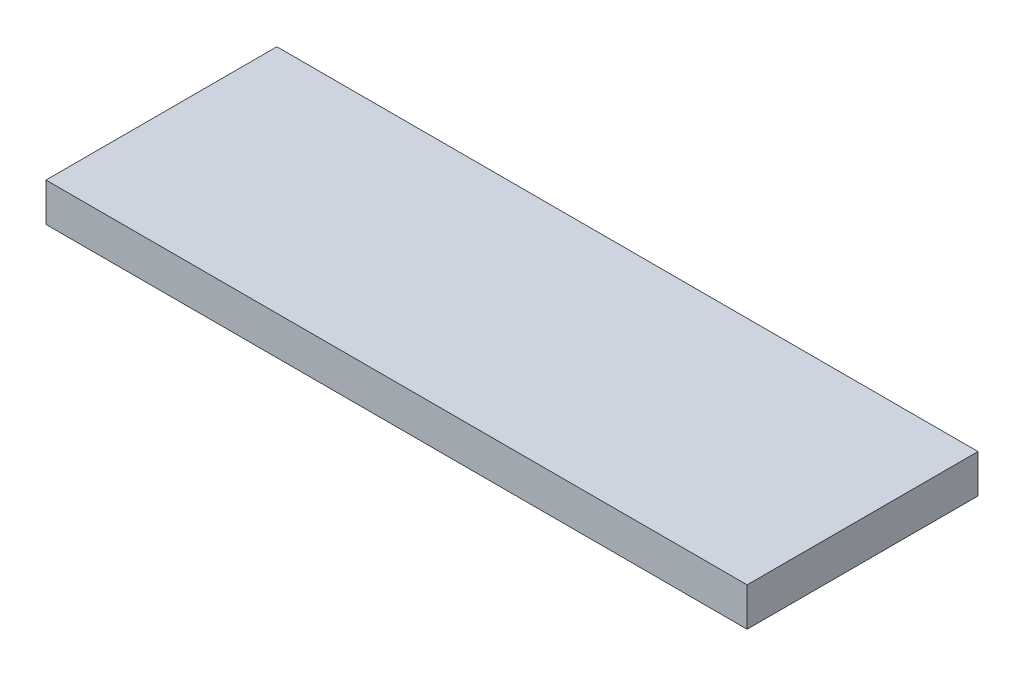
ISO-10303-21;
HEADER;
FILE_DESCRIPTION(('STEP AP214'),'2;1');
FILE_NAME('part.step','',(''),(''),'','','');
FILE_SCHEMA(('AUTOMOTIVE_DESIGN { 1 0 10303 214 1 1 1 1 }'));
ENDSEC;
DATA;
#1=APPLICATION_CONTEXT('core data for automotive mechanical design processes');
#2=APPLICATION_PROTOCOL_DEFINITION('international standard','automotive_design',2000,#1);
#3=PRODUCT_CONTEXT('',#1,'mechanical');
#4=PRODUCT('Part','Part','',(#3));
#5=PRODUCT_RELATED_PRODUCT_CATEGORY('part','',(#4));
#6=PRODUCT_DEFINITION_FORMATION('','',#4);
#7=PRODUCT_DEFINITION_CONTEXT('part definition',#1,'design');
#8=PRODUCT_DEFINITION('design','',#6,#7);
#9=PRODUCT_DEFINITION_SHAPE('','',#8);
#10=(LENGTH_UNIT() NAMED_UNIT(*) SI_UNIT(.MILLI.,.METRE.));
#11=(NAMED_UNIT(*) PLANE_ANGLE_UNIT() SI_UNIT($,.RADIAN.));
#12=(NAMED_UNIT(*) SI_UNIT($,.STERADIAN.) SOLID_ANGLE_UNIT());
#13=UNCERTAINTY_MEASURE_WITH_UNIT(LENGTH_MEASURE(1.E-05),#10,'distance_accuracy_value','');
#14=(GEOMETRIC_REPRESENTATION_CONTEXT(3) GLOBAL_UNCERTAINTY_ASSIGNED_CONTEXT((#13)) GLOBAL_UNIT_ASSIGNED_CONTEXT((#10,
#11,#12)) REPRESENTATION_CONTEXT('',''));
#15=CARTESIAN_POINT('',(0.,0.,0.));
#16=DIRECTION('',(0.,0.,1.));
#17=DIRECTION('',(1.,0.,0.));
#18=AXIS2_PLACEMENT_3D('',#15,#16,#17);
#19=CARTESIAN_POINT('',(82.,9.,27.));
#20=DIRECTION('',(-1.,0.,0.));
#21=DIRECTION('',(0.,0.,1.));
#22=AXIS2_PLACEMENT_3D('',#19,#20,#21);
#23=PLANE('',#22);
#24=DIRECTION('',(0.,0.,-1.));
#25=VECTOR('',#24,1.);
#26=CARTESIAN_POINT('',(82.,0.,27.));
#27=LINE('',#26,#25);
#28=CARTESIAN_POINT('',(82.,0.,27.));
#29=VERTEX_POINT('',#28);
#30=CARTESIAN_POINT('',(82.,0.,-27.));
#31=VERTEX_POINT('',#30);
#32=EDGE_CURVE('E105',#29,#31,#27,.T.);
#33=ORIENTED_EDGE('',*,*,#32,.T.);
#34=DIRECTION('',(0.,-1.,0.));
#35=VECTOR('',#34,1.);
#36=CARTESIAN_POINT('',(82.,9.,-27.));
#37=LINE('',#36,#35);
#38=CARTESIAN_POINT('',(82.,9.,-27.));
#39=VERTEX_POINT('',#38);
#40=EDGE_CURVE('E11',#39,#31,#37,.T.);
#41=ORIENTED_EDGE('',*,*,#40,.F.);
#42=DIRECTION('',(0.,0.,-1.));
#43=VECTOR('',#42,1.);
#44=CARTESIAN_POINT('',(82.,9.,27.));
#45=LINE('',#44,#43);
#46=CARTESIAN_POINT('',(82.,9.,27.));
#47=VERTEX_POINT('',#46);
#48=EDGE_CURVE('E89',#47,#39,#45,.T.);
#49=ORIENTED_EDGE('',*,*,#48,.F.);
#50=DIRECTION('',(0.,-1.,0.));
#51=VECTOR('',#50,1.);
#52=CARTESIAN_POINT('',(82.,9.,27.));
#53=LINE('',#52,#51);
#54=EDGE_CURVE('E98',#47,#29,#53,.T.);
#55=ORIENTED_EDGE('',*,*,#54,.T.);
#56=EDGE_LOOP('',(#33,#41,#49,#55));
#57=FACE_BOUND('',#56,.T.);
#58=ADVANCED_FACE('F39',(#57),#23,.F.);
#59=CARTESIAN_POINT('',(-82.,9.,-27.));
#60=DIRECTION('',(0.,0.,1.));
#61=DIRECTION('',(1.,0.,0.));
#62=AXIS2_PLACEMENT_3D('',#59,#60,#61);
#63=PLANE('',#62);
#64=DIRECTION('',(-1.,0.,0.));
#65=VECTOR('',#64,1.);
#66=CARTESIAN_POINT('',(-82.,0.,-27.));
#67=LINE('',#66,#65);
#68=CARTESIAN_POINT('',(-82.,0.,-27.));
#69=VERTEX_POINT('',#68);
#70=EDGE_CURVE('E94',#31,#69,#67,.T.);
#71=ORIENTED_EDGE('',*,*,#70,.T.);
#72=DIRECTION('',(0.,-1.,0.));
#73=VECTOR('',#72,1.);
#74=CARTESIAN_POINT('',(-82.,9.,-27.));
#75=LINE('',#74,#73);
#76=CARTESIAN_POINT('',(-82.,9.,-27.));
#77=VERTEX_POINT('',#76);
#78=EDGE_CURVE('E50',#77,#69,#75,.T.);
#79=ORIENTED_EDGE('',*,*,#78,.F.);
#80=DIRECTION('',(-1.,0.,0.));
#81=VECTOR('',#80,1.);
#82=CARTESIAN_POINT('',(-82.,9.,-27.));
#83=LINE('',#82,#81);
#84=EDGE_CURVE('E84',#39,#77,#83,.T.);
#85=ORIENTED_EDGE('',*,*,#84,.F.);
#86=ORIENTED_EDGE('',*,*,#40,.T.);
#87=EDGE_LOOP('',(#71,#79,#85,#86));
#88=FACE_BOUND('',#87,.T.);
#89=ADVANCED_FACE('F91',(#88),#63,.F.);
#90=CARTESIAN_POINT('',(-82.,9.,27.));
#91=DIRECTION('',(1.,0.,0.));
#92=DIRECTION('',(0.,0.,-1.));
#93=AXIS2_PLACEMENT_3D('',#90,#91,#92);
#94=PLANE('',#93);
#95=DIRECTION('',(0.,0.,1.));
#96=VECTOR('',#95,1.);
#97=CARTESIAN_POINT('',(-82.,0.,27.));
#98=LINE('',#97,#96);
#99=CARTESIAN_POINT('',(-82.,0.,27.));
#100=VERTEX_POINT('',#99);
#101=EDGE_CURVE('E75',#69,#100,#98,.T.);
#102=ORIENTED_EDGE('',*,*,#101,.T.);
#103=DIRECTION('',(0.,-1.,0.));
#104=VECTOR('',#103,1.);
#105=CARTESIAN_POINT('',(-82.,9.,27.));
#106=LINE('',#105,#104);
#107=CARTESIAN_POINT('',(-82.,9.,27.));
#108=VERTEX_POINT('',#107);
#109=EDGE_CURVE('E92',#108,#100,#106,.T.);
#110=ORIENTED_EDGE('',*,*,#109,.F.);
#111=DIRECTION('',(0.,0.,1.));
#112=VECTOR('',#111,1.);
#113=CARTESIAN_POINT('',(-82.,9.,27.));
#114=LINE('',#113,#112);
#115=EDGE_CURVE('E86',#77,#108,#114,.T.);
#116=ORIENTED_EDGE('',*,*,#115,.F.);
#117=ORIENTED_EDGE('',*,*,#78,.T.);
#118=EDGE_LOOP('',(#102,#110,#116,#117));
#119=FACE_BOUND('',#118,.T.);
#120=ADVANCED_FACE('F96',(#119),#94,.F.);
#121=CARTESIAN_POINT('',(-82.,9.,27.));
#122=DIRECTION('',(0.,0.,-1.));
#123=DIRECTION('',(-1.,0.,0.));
#124=AXIS2_PLACEMENT_3D('',#121,#122,#123);
#125=PLANE('',#124);
#126=DIRECTION('',(1.,0.,0.));
#127=VECTOR('',#126,1.);
#128=CARTESIAN_POINT('',(-82.,0.,27.));
#129=LINE('',#128,#127);
#130=EDGE_CURVE('E79',#100,#29,#129,.T.);
#131=ORIENTED_EDGE('',*,*,#130,.T.);
#132=ORIENTED_EDGE('',*,*,#54,.F.);
#133=DIRECTION('',(1.,0.,0.));
#134=VECTOR('',#133,1.);
#135=CARTESIAN_POINT('',(-82.,9.,27.));
#136=LINE('',#135,#134);
#137=EDGE_CURVE('E54',#108,#47,#136,.T.);
#138=ORIENTED_EDGE('',*,*,#137,.F.);
#139=ORIENTED_EDGE('',*,*,#109,.T.);
#140=EDGE_LOOP('',(#131,#132,#138,#139));
#141=FACE_BOUND('',#140,.T.);
#142=ADVANCED_FACE('F108',(#141),#125,.F.);
#143=CARTESIAN_POINT('',(0.,9.,0.));
#144=DIRECTION('',(0.,-1.,0.));
#145=DIRECTION('',(0.,0.,-1.));
#146=AXIS2_PLACEMENT_3D('',#143,#144,#145);
#147=PLANE('',#146);
#148=ORIENTED_EDGE('',*,*,#48,.T.);
#149=ORIENTED_EDGE('',*,*,#84,.T.);
#150=ORIENTED_EDGE('',*,*,#115,.T.);
#151=ORIENTED_EDGE('',*,*,#137,.T.);
#152=EDGE_LOOP('',(#148,#149,#150,#151));
#153=FACE_BOUND('',#152,.T.);
#154=ADVANCED_FACE('F88',(#153),#147,.F.);
#155=CARTESIAN_POINT('',(0.,0.,0.));
#156=DIRECTION('',(0.,-1.,0.));
#157=DIRECTION('',(0.,0.,-1.));
#158=AXIS2_PLACEMENT_3D('',#155,#156,#157);
#159=PLANE('',#158);
#160=ORIENTED_EDGE('',*,*,#32,.F.);
#161=ORIENTED_EDGE('',*,*,#130,.F.);
#162=ORIENTED_EDGE('',*,*,#101,.F.);
#163=ORIENTED_EDGE('',*,*,#70,.F.);
#164=EDGE_LOOP('',(#160,#161,#162,#163));
#165=FACE_BOUND('',#164,.T.);
#166=ADVANCED_FACE('F115',(#165),#159,.T.);
#167=CLOSED_SHELL('',(#58,#89,#120,#142,#154,#166));
#168=MANIFOLD_SOLID_BREP('B2',#167);
#169=ADVANCED_BREP_SHAPE_REPRESENTATION('',(#18,#168),#14);
#170=SHAPE_DEFINITION_REPRESENTATION(#9,#169);
ENDSEC;
END-ISO-10303-21;
